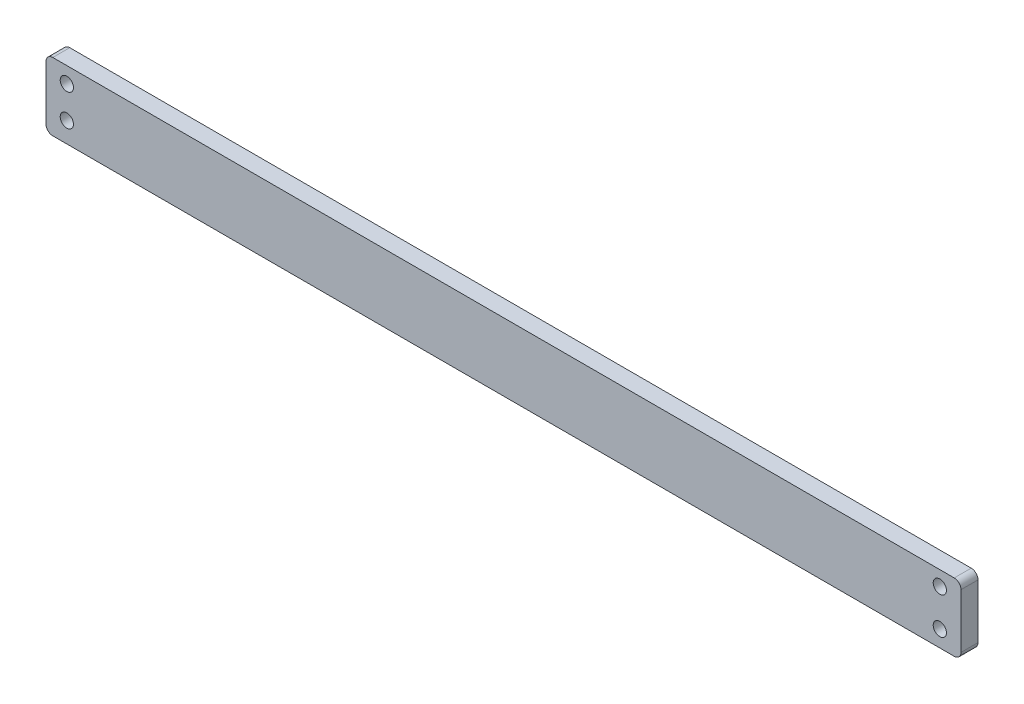
ISO-10303-21;
HEADER;
FILE_DESCRIPTION(('STEP AP214'),'2;1');
FILE_NAME('part.step','',(''),(''),'','','');
FILE_SCHEMA(('AUTOMOTIVE_DESIGN { 1 0 10303 214 1 1 1 1 }'));
ENDSEC;
DATA;
#1=APPLICATION_CONTEXT('core data for automotive mechanical design processes');
#2=APPLICATION_PROTOCOL_DEFINITION('international standard','automotive_design',2000,#1);
#3=PRODUCT_CONTEXT('',#1,'mechanical');
#4=PRODUCT('Part','Part','',(#3));
#5=PRODUCT_RELATED_PRODUCT_CATEGORY('part','',(#4));
#6=PRODUCT_DEFINITION_FORMATION('','',#4);
#7=PRODUCT_DEFINITION_CONTEXT('part definition',#1,'design');
#8=PRODUCT_DEFINITION('design','',#6,#7);
#9=PRODUCT_DEFINITION_SHAPE('','',#8);
#10=(LENGTH_UNIT() NAMED_UNIT(*) SI_UNIT(.MILLI.,.METRE.));
#11=(NAMED_UNIT(*) PLANE_ANGLE_UNIT() SI_UNIT($,.RADIAN.));
#12=(NAMED_UNIT(*) SI_UNIT($,.STERADIAN.) SOLID_ANGLE_UNIT());
#13=UNCERTAINTY_MEASURE_WITH_UNIT(LENGTH_MEASURE(1.E-05),#10,'distance_accuracy_value','');
#14=(GEOMETRIC_REPRESENTATION_CONTEXT(3) GLOBAL_UNCERTAINTY_ASSIGNED_CONTEXT((#13)) GLOBAL_UNIT_ASSIGNED_CONTEXT((#10,
#11,#12)) REPRESENTATION_CONTEXT('',''));
#15=CARTESIAN_POINT('',(0.,0.,0.));
#16=DIRECTION('',(0.,0.,1.));
#17=DIRECTION('',(1.,0.,0.));
#18=AXIS2_PLACEMENT_3D('',#15,#16,#17);
#19=CARTESIAN_POINT('',(-3.51437213559947,54.8154965170172,5.));
#20=DIRECTION('',(0.,0.,-1.));
#21=DIRECTION('',(-1.,0.,0.));
#22=AXIS2_PLACEMENT_3D('',#19,#20,#21);
#23=PLANE('',#22);
#24=CARTESIAN_POINT('',(-3.51437213559947,54.8154965170172,5.));
#25=DIRECTION('',(0.,0.,1.));
#26=DIRECTION('',(-1.,0.,0.));
#27=AXIS2_PLACEMENT_3D('',#24,#25,#26);
#28=CIRCLE('',#27,2.);
#29=CARTESIAN_POINT('',(-3.51437213559947,56.8154965170172,5.));
#30=VERTEX_POINT('',#29);
#31=CARTESIAN_POINT('',(-5.51437213559947,54.8154965170172,5.));
#32=VERTEX_POINT('',#31);
#33=EDGE_CURVE('E149',#30,#32,#28,.T.);
#34=ORIENTED_EDGE('',*,*,#33,.T.);
#35=DIRECTION('',(0.,-1.,0.));
#36=VECTOR('',#35,1.);
#37=CARTESIAN_POINT('',(-5.51437213559947,38.8154965170172,5.));
#38=LINE('',#37,#36);
#39=CARTESIAN_POINT('',(-5.51437213559947,38.8154965170172,5.));
#40=VERTEX_POINT('',#39);
#41=EDGE_CURVE('E97',#32,#40,#38,.T.);
#42=ORIENTED_EDGE('',*,*,#41,.T.);
#43=CARTESIAN_POINT('',(-3.51437213559947,38.8154965170172,5.));
#44=DIRECTION('',(0.,0.,1.));
#45=DIRECTION('',(-1.,0.,0.));
#46=AXIS2_PLACEMENT_3D('',#43,#44,#45);
#47=CIRCLE('',#46,2.);
#48=CARTESIAN_POINT('',(-3.51437213559947,36.8154965170172,5.));
#49=VERTEX_POINT('',#48);
#50=EDGE_CURVE('E164',#40,#49,#47,.T.);
#51=ORIENTED_EDGE('',*,*,#50,.T.);
#52=DIRECTION('',(1.,0.,0.));
#53=VECTOR('',#52,1.);
#54=CARTESIAN_POINT('',(-3.51437213559947,36.8154965170172,5.));
#55=LINE('',#54,#53);
#56=CARTESIAN_POINT('',(262.040865352234,36.8154965170172,5.));
#57=VERTEX_POINT('',#56);
#58=EDGE_CURVE('E177',#49,#57,#55,.T.);
#59=ORIENTED_EDGE('',*,*,#58,.T.);
#60=CARTESIAN_POINT('',(262.040865352234,38.8154965170172,5.));
#61=DIRECTION('',(0.,0.,1.));
#62=DIRECTION('',(1.,0.,0.));
#63=AXIS2_PLACEMENT_3D('',#60,#61,#62);
#64=CIRCLE('',#63,2.);
#65=CARTESIAN_POINT('',(264.040865352234,38.8154965170172,5.));
#66=VERTEX_POINT('',#65);
#67=EDGE_CURVE('E116',#57,#66,#64,.T.);
#68=ORIENTED_EDGE('',*,*,#67,.T.);
#69=DIRECTION('',(0.,1.,0.));
#70=VECTOR('',#69,1.);
#71=CARTESIAN_POINT('',(264.040865352234,38.8154965170172,5.));
#72=LINE('',#71,#70);
#73=CARTESIAN_POINT('',(264.040865352234,54.8154965170172,5.));
#74=VERTEX_POINT('',#73);
#75=EDGE_CURVE('E110',#66,#74,#72,.T.);
#76=ORIENTED_EDGE('',*,*,#75,.T.);
#77=CARTESIAN_POINT('',(262.040865352234,54.8154965170172,5.));
#78=DIRECTION('',(0.,0.,1.));
#79=DIRECTION('',(-1.,0.,0.));
#80=AXIS2_PLACEMENT_3D('',#77,#78,#79);
#81=CIRCLE('',#80,2.);
#82=CARTESIAN_POINT('',(262.040865352234,56.8154965170172,5.));
#83=VERTEX_POINT('',#82);
#84=EDGE_CURVE('E114',#74,#83,#81,.T.);
#85=ORIENTED_EDGE('',*,*,#84,.T.);
#86=DIRECTION('',(-1.,0.,0.));
#87=VECTOR('',#86,1.);
#88=CARTESIAN_POINT('',(-3.51437213559947,56.8154965170172,5.));
#89=LINE('',#88,#87);
#90=EDGE_CURVE('E54',#83,#30,#89,.T.);
#91=ORIENTED_EDGE('',*,*,#90,.T.);
#92=EDGE_LOOP('',(#34,#42,#51,#59,#68,#76,#85,#91));
#93=FACE_BOUND('',#92,.T.);
#94=CARTESIAN_POINT('',(0.621260050170748,42.8077298266429,5.));
#95=DIRECTION('',(0.,0.,1.));
#96=DIRECTION('',(1.,0.,0.));
#97=AXIS2_PLACEMENT_3D('',#94,#95,#96);
#98=CIRCLE('',#97,1.95);
#99=CARTESIAN_POINT('',(2.57126005017075,42.8077298266429,5.));
#100=VERTEX_POINT('',#99);
#101=EDGE_CURVE('E138',#100,#100,#98,.T.);
#102=ORIENTED_EDGE('',*,*,#101,.F.);
#103=EDGE_LOOP('',(#102));
#104=FACE_BOUND('',#103,.T.);
#105=CARTESIAN_POINT('',(0.621260050170748,52.15637262832,5.));
#106=DIRECTION('',(0.,0.,1.));
#107=DIRECTION('',(1.,0.,0.));
#108=AXIS2_PLACEMENT_3D('',#105,#106,#107);
#109=CIRCLE('',#108,1.95);
#110=CARTESIAN_POINT('',(2.57126005017075,52.15637262832,5.));
#111=VERTEX_POINT('',#110);
#112=EDGE_CURVE('E186',#111,#111,#109,.T.);
#113=ORIENTED_EDGE('',*,*,#112,.F.);
#114=EDGE_LOOP('',(#113));
#115=FACE_BOUND('',#114,.T.);
#116=CARTESIAN_POINT('',(257.791885291441,41.6686999628682,5.));
#117=DIRECTION('',(0.,0.,1.));
#118=DIRECTION('',(1.,0.,0.));
#119=AXIS2_PLACEMENT_3D('',#116,#117,#118);
#120=CIRCLE('',#119,1.95000000000003);
#121=CARTESIAN_POINT('',(259.741885291441,41.6686999628682,5.));
#122=VERTEX_POINT('',#121);
#123=EDGE_CURVE('E192',#122,#122,#120,.T.);
#124=ORIENTED_EDGE('',*,*,#123,.F.);
#125=EDGE_LOOP('',(#124));
#126=FACE_BOUND('',#125,.T.);
#127=CARTESIAN_POINT('',(257.791885291441,52.4810500846292,5.));
#128=DIRECTION('',(0.,0.,1.));
#129=DIRECTION('',(1.,0.,0.));
#130=AXIS2_PLACEMENT_3D('',#127,#128,#129);
#131=CIRCLE('',#130,1.95000000000003);
#132=CARTESIAN_POINT('',(259.741885291441,52.4810500846292,5.));
#133=VERTEX_POINT('',#132);
#134=EDGE_CURVE('E198',#133,#133,#131,.T.);
#135=ORIENTED_EDGE('',*,*,#134,.F.);
#136=EDGE_LOOP('',(#135));
#137=FACE_BOUND('',#136,.T.);
#138=ADVANCED_FACE('F37',(#93,#104,#115,#126,#137),#23,.F.);
#139=CARTESIAN_POINT('',(-3.51437213559947,54.8154965170172,0.));
#140=DIRECTION('',(0.,0.,-1.));
#141=DIRECTION('',(-1.,0.,0.));
#142=AXIS2_PLACEMENT_3D('',#139,#140,#141);
#143=PLANE('',#142);
#144=CARTESIAN_POINT('',(257.791885291441,41.6686999628682,0.));
#145=DIRECTION('',(0.,0.,1.));
#146=DIRECTION('',(1.,0.,0.));
#147=AXIS2_PLACEMENT_3D('',#144,#145,#146);
#148=CIRCLE('',#147,1.95000000000003);
#149=CARTESIAN_POINT('',(259.741885291441,41.6686999628682,0.));
#150=VERTEX_POINT('',#149);
#151=EDGE_CURVE('E195',#150,#150,#148,.T.);
#152=ORIENTED_EDGE('',*,*,#151,.T.);
#153=EDGE_LOOP('',(#152));
#154=FACE_BOUND('',#153,.T.);
#155=CARTESIAN_POINT('',(0.621260050170748,42.8077298266429,0.));
#156=DIRECTION('',(0.,0.,1.));
#157=DIRECTION('',(1.,0.,0.));
#158=AXIS2_PLACEMENT_3D('',#155,#156,#157);
#159=CIRCLE('',#158,1.95);
#160=CARTESIAN_POINT('',(2.57126005017075,42.8077298266429,0.));
#161=VERTEX_POINT('',#160);
#162=EDGE_CURVE('E183',#161,#161,#159,.T.);
#163=ORIENTED_EDGE('',*,*,#162,.T.);
#164=EDGE_LOOP('',(#163));
#165=FACE_BOUND('',#164,.T.);
#166=CARTESIAN_POINT('',(-3.51437213559947,54.8154965170172,0.));
#167=DIRECTION('',(0.,0.,1.));
#168=DIRECTION('',(-1.,0.,0.));
#169=AXIS2_PLACEMENT_3D('',#166,#167,#168);
#170=CIRCLE('',#169,2.);
#171=CARTESIAN_POINT('',(-3.51437213559947,56.8154965170172,0.));
#172=VERTEX_POINT('',#171);
#173=CARTESIAN_POINT('',(-5.51437213559947,54.8154965170172,0.));
#174=VERTEX_POINT('',#173);
#175=EDGE_CURVE('E134',#172,#174,#170,.T.);
#176=ORIENTED_EDGE('',*,*,#175,.F.);
#177=DIRECTION('',(-1.,0.,0.));
#178=VECTOR('',#177,1.);
#179=CARTESIAN_POINT('',(-3.51437213559947,56.8154965170172,0.));
#180=LINE('',#179,#178);
#181=CARTESIAN_POINT('',(262.040865352234,56.8154965170172,0.));
#182=VERTEX_POINT('',#181);
#183=EDGE_CURVE('E89',#182,#172,#180,.T.);
#184=ORIENTED_EDGE('',*,*,#183,.F.);
#185=CARTESIAN_POINT('',(262.040865352234,54.8154965170172,0.));
#186=DIRECTION('',(0.,0.,1.));
#187=DIRECTION('',(-1.,0.,0.));
#188=AXIS2_PLACEMENT_3D('',#185,#186,#187);
#189=CIRCLE('',#188,2.);
#190=CARTESIAN_POINT('',(264.040865352234,54.8154965170172,0.));
#191=VERTEX_POINT('',#190);
#192=EDGE_CURVE('E83',#191,#182,#189,.T.);
#193=ORIENTED_EDGE('',*,*,#192,.F.);
#194=DIRECTION('',(0.,1.,0.));
#195=VECTOR('',#194,1.);
#196=CARTESIAN_POINT('',(264.040865352234,38.8154965170172,0.));
#197=LINE('',#196,#195);
#198=CARTESIAN_POINT('',(264.040865352234,38.8154965170172,0.));
#199=VERTEX_POINT('',#198);
#200=EDGE_CURVE('E124',#199,#191,#197,.T.);
#201=ORIENTED_EDGE('',*,*,#200,.F.);
#202=CARTESIAN_POINT('',(262.040865352234,38.8154965170172,0.));
#203=DIRECTION('',(0.,0.,1.));
#204=DIRECTION('',(1.,0.,0.));
#205=AXIS2_PLACEMENT_3D('',#202,#203,#204);
#206=CIRCLE('',#205,2.);
#207=CARTESIAN_POINT('',(262.040865352234,36.8154965170172,0.));
#208=VERTEX_POINT('',#207);
#209=EDGE_CURVE('E144',#208,#199,#206,.T.);
#210=ORIENTED_EDGE('',*,*,#209,.F.);
#211=DIRECTION('',(1.,0.,0.));
#212=VECTOR('',#211,1.);
#213=CARTESIAN_POINT('',(-3.51437213559947,36.8154965170172,0.));
#214=LINE('',#213,#212);
#215=CARTESIAN_POINT('',(-3.51437213559947,36.8154965170172,0.));
#216=VERTEX_POINT('',#215);
#217=EDGE_CURVE('E142',#216,#208,#214,.T.);
#218=ORIENTED_EDGE('',*,*,#217,.F.);
#219=CARTESIAN_POINT('',(-3.51437213559947,38.8154965170172,0.));
#220=DIRECTION('',(0.,0.,1.));
#221=DIRECTION('',(-1.,0.,0.));
#222=AXIS2_PLACEMENT_3D('',#219,#220,#221);
#223=CIRCLE('',#222,2.);
#224=CARTESIAN_POINT('',(-5.51437213559947,38.8154965170172,0.));
#225=VERTEX_POINT('',#224);
#226=EDGE_CURVE('E140',#225,#216,#223,.T.);
#227=ORIENTED_EDGE('',*,*,#226,.F.);
#228=DIRECTION('',(0.,-1.,0.));
#229=VECTOR('',#228,1.);
#230=CARTESIAN_POINT('',(-5.51437213559947,38.8154965170172,0.));
#231=LINE('',#230,#229);
#232=EDGE_CURVE('E137',#174,#225,#231,.T.);
#233=ORIENTED_EDGE('',*,*,#232,.F.);
#234=EDGE_LOOP('',(#176,#184,#193,#201,#210,#218,#227,#233));
#235=FACE_BOUND('',#234,.T.);
#236=CARTESIAN_POINT('',(0.621260050170748,52.15637262832,0.));
#237=DIRECTION('',(0.,0.,1.));
#238=DIRECTION('',(1.,0.,0.));
#239=AXIS2_PLACEMENT_3D('',#236,#237,#238);
#240=CIRCLE('',#239,1.95);
#241=CARTESIAN_POINT('',(2.57126005017075,52.15637262832,0.));
#242=VERTEX_POINT('',#241);
#243=EDGE_CURVE('E189',#242,#242,#240,.T.);
#244=ORIENTED_EDGE('',*,*,#243,.T.);
#245=EDGE_LOOP('',(#244));
#246=FACE_BOUND('',#245,.T.);
#247=CARTESIAN_POINT('',(257.791885291441,52.4810500846292,0.));
#248=DIRECTION('',(0.,0.,1.));
#249=DIRECTION('',(1.,0.,0.));
#250=AXIS2_PLACEMENT_3D('',#247,#248,#249);
#251=CIRCLE('',#250,1.95000000000003);
#252=CARTESIAN_POINT('',(259.741885291441,52.4810500846292,0.));
#253=VERTEX_POINT('',#252);
#254=EDGE_CURVE('E201',#253,#253,#251,.T.);
#255=ORIENTED_EDGE('',*,*,#254,.T.);
#256=EDGE_LOOP('',(#255));
#257=FACE_BOUND('',#256,.T.);
#258=ADVANCED_FACE('F168',(#154,#165,#235,#246,#257),#143,.T.);
#259=CARTESIAN_POINT('',(-3.51437213559947,54.8154965170172,5.));
#260=DIRECTION('',(0.,0.,-1.));
#261=DIRECTION('',(-1.,0.,0.));
#262=AXIS2_PLACEMENT_3D('',#259,#260,#261);
#263=CYLINDRICAL_SURFACE('',#262,2.);
#264=ORIENTED_EDGE('',*,*,#175,.T.);
#265=DIRECTION('',(0.,0.,-1.));
#266=VECTOR('',#265,1.);
#267=CARTESIAN_POINT('',(-5.51437213559947,54.8154965170172,5.));
#268=LINE('',#267,#266);
#269=EDGE_CURVE('E11',#32,#174,#268,.T.);
#270=ORIENTED_EDGE('',*,*,#269,.F.);
#271=ORIENTED_EDGE('',*,*,#33,.F.);
#272=DIRECTION('',(0.,0.,-1.));
#273=VECTOR('',#272,1.);
#274=CARTESIAN_POINT('',(-3.51437213559947,56.8154965170172,5.));
#275=LINE('',#274,#273);
#276=EDGE_CURVE('E130',#30,#172,#275,.T.);
#277=ORIENTED_EDGE('',*,*,#276,.T.);
#278=EDGE_LOOP('',(#264,#270,#271,#277));
#279=FACE_BOUND('',#278,.T.);
#280=ADVANCED_FACE('F39',(#279),#263,.T.);
#281=CARTESIAN_POINT('',(-5.51437213559947,38.8154965170172,5.));
#282=DIRECTION('',(1.,0.,0.));
#283=DIRECTION('',(0.,0.,-1.));
#284=AXIS2_PLACEMENT_3D('',#281,#282,#283);
#285=PLANE('',#284);
#286=ORIENTED_EDGE('',*,*,#232,.T.);
#287=DIRECTION('',(0.,0.,-1.));
#288=VECTOR('',#287,1.);
#289=CARTESIAN_POINT('',(-5.51437213559947,38.8154965170172,5.));
#290=LINE('',#289,#288);
#291=EDGE_CURVE('E46',#40,#225,#290,.T.);
#292=ORIENTED_EDGE('',*,*,#291,.F.);
#293=ORIENTED_EDGE('',*,*,#41,.F.);
#294=ORIENTED_EDGE('',*,*,#269,.T.);
#295=EDGE_LOOP('',(#286,#292,#293,#294));
#296=FACE_BOUND('',#295,.T.);
#297=ADVANCED_FACE('F233',(#296),#285,.F.);
#298=CARTESIAN_POINT('',(-3.51437213559947,38.8154965170172,5.));
#299=DIRECTION('',(0.,0.,-1.));
#300=DIRECTION('',(-1.,0.,0.));
#301=AXIS2_PLACEMENT_3D('',#298,#299,#300);
#302=CYLINDRICAL_SURFACE('',#301,2.);
#303=ORIENTED_EDGE('',*,*,#226,.T.);
#304=DIRECTION('',(0.,0.,-1.));
#305=VECTOR('',#304,1.);
#306=CARTESIAN_POINT('',(-3.51437213559947,36.8154965170172,5.));
#307=LINE('',#306,#305);
#308=EDGE_CURVE('E156',#49,#216,#307,.T.);
#309=ORIENTED_EDGE('',*,*,#308,.F.);
#310=ORIENTED_EDGE('',*,*,#50,.F.);
#311=ORIENTED_EDGE('',*,*,#291,.T.);
#312=EDGE_LOOP('',(#303,#309,#310,#311));
#313=FACE_BOUND('',#312,.T.);
#314=ADVANCED_FACE('F162',(#313),#302,.T.);
#315=CARTESIAN_POINT('',(-3.51437213559947,36.8154965170172,5.));
#316=DIRECTION('',(0.,1.,0.));
#317=DIRECTION('',(0.,0.,1.));
#318=AXIS2_PLACEMENT_3D('',#315,#316,#317);
#319=PLANE('',#318);
#320=ORIENTED_EDGE('',*,*,#217,.T.);
#321=DIRECTION('',(0.,0.,-1.));
#322=VECTOR('',#321,1.);
#323=CARTESIAN_POINT('',(262.040865352234,36.8154965170172,5.));
#324=LINE('',#323,#322);
#325=EDGE_CURVE('E153',#57,#208,#324,.T.);
#326=ORIENTED_EDGE('',*,*,#325,.F.);
#327=ORIENTED_EDGE('',*,*,#58,.F.);
#328=ORIENTED_EDGE('',*,*,#308,.T.);
#329=EDGE_LOOP('',(#320,#326,#327,#328));
#330=FACE_BOUND('',#329,.T.);
#331=ADVANCED_FACE('F173',(#330),#319,.F.);
#332=CARTESIAN_POINT('',(262.040865352234,38.8154965170172,5.));
#333=DIRECTION('',(0.,0.,-1.));
#334=DIRECTION('',(-1.,0.,0.));
#335=AXIS2_PLACEMENT_3D('',#332,#333,#334);
#336=CYLINDRICAL_SURFACE('',#335,2.);
#337=ORIENTED_EDGE('',*,*,#209,.T.);
#338=DIRECTION('',(0.,0.,-1.));
#339=VECTOR('',#338,1.);
#340=CARTESIAN_POINT('',(264.040865352234,38.8154965170172,5.));
#341=LINE('',#340,#339);
#342=EDGE_CURVE('E125',#66,#199,#341,.T.);
#343=ORIENTED_EDGE('',*,*,#342,.F.);
#344=ORIENTED_EDGE('',*,*,#67,.F.);
#345=ORIENTED_EDGE('',*,*,#325,.T.);
#346=EDGE_LOOP('',(#337,#343,#344,#345));
#347=FACE_BOUND('',#346,.T.);
#348=ADVANCED_FACE('F176',(#347),#336,.T.);
#349=CARTESIAN_POINT('',(264.040865352234,38.8154965170172,5.));
#350=DIRECTION('',(-1.,0.,0.));
#351=DIRECTION('',(0.,0.,1.));
#352=AXIS2_PLACEMENT_3D('',#349,#350,#351);
#353=PLANE('',#352);
#354=ORIENTED_EDGE('',*,*,#200,.T.);
#355=DIRECTION('',(0.,0.,-1.));
#356=VECTOR('',#355,1.);
#357=CARTESIAN_POINT('',(264.040865352234,54.8154965170172,5.));
#358=LINE('',#357,#356);
#359=EDGE_CURVE('E121',#74,#191,#358,.T.);
#360=ORIENTED_EDGE('',*,*,#359,.F.);
#361=ORIENTED_EDGE('',*,*,#75,.F.);
#362=ORIENTED_EDGE('',*,*,#342,.T.);
#363=EDGE_LOOP('',(#354,#360,#361,#362));
#364=FACE_BOUND('',#363,.T.);
#365=ADVANCED_FACE('F122',(#364),#353,.F.);
#366=CARTESIAN_POINT('',(262.040865352234,54.8154965170172,5.));
#367=DIRECTION('',(0.,0.,-1.));
#368=DIRECTION('',(-1.,0.,0.));
#369=AXIS2_PLACEMENT_3D('',#366,#367,#368);
#370=CYLINDRICAL_SURFACE('',#369,2.);
#371=ORIENTED_EDGE('',*,*,#192,.T.);
#372=DIRECTION('',(0.,0.,-1.));
#373=VECTOR('',#372,1.);
#374=CARTESIAN_POINT('',(262.040865352234,56.8154965170172,5.));
#375=LINE('',#374,#373);
#376=EDGE_CURVE('E126',#83,#182,#375,.T.);
#377=ORIENTED_EDGE('',*,*,#376,.F.);
#378=ORIENTED_EDGE('',*,*,#84,.F.);
#379=ORIENTED_EDGE('',*,*,#359,.T.);
#380=EDGE_LOOP('',(#371,#377,#378,#379));
#381=FACE_BOUND('',#380,.T.);
#382=ADVANCED_FACE('F128',(#381),#370,.T.);
#383=CARTESIAN_POINT('',(-3.51437213559947,56.8154965170172,5.));
#384=DIRECTION('',(0.,-1.,0.));
#385=DIRECTION('',(0.,0.,-1.));
#386=AXIS2_PLACEMENT_3D('',#383,#384,#385);
#387=PLANE('',#386);
#388=ORIENTED_EDGE('',*,*,#183,.T.);
#389=ORIENTED_EDGE('',*,*,#276,.F.);
#390=ORIENTED_EDGE('',*,*,#90,.F.);
#391=ORIENTED_EDGE('',*,*,#376,.T.);
#392=EDGE_LOOP('',(#388,#389,#390,#391));
#393=FACE_BOUND('',#392,.T.);
#394=ADVANCED_FACE('F221',(#393),#387,.F.);
#395=CARTESIAN_POINT('',(0.621260050170748,42.8077298266429,5.));
#396=DIRECTION('',(0.,0.,-1.));
#397=DIRECTION('',(-1.,0.,0.));
#398=AXIS2_PLACEMENT_3D('',#395,#396,#397);
#399=CYLINDRICAL_SURFACE('',#398,1.95);
#400=ORIENTED_EDGE('',*,*,#101,.T.);
#401=EDGE_LOOP('',(#400));
#402=FACE_BOUND('',#401,.T.);
#403=ORIENTED_EDGE('',*,*,#162,.F.);
#404=EDGE_LOOP('',(#403));
#405=FACE_BOUND('',#404,.T.);
#406=ADVANCED_FACE('F218',(#402,#405),#399,.F.);
#407=CARTESIAN_POINT('',(0.621260050170748,52.15637262832,5.));
#408=DIRECTION('',(0.,0.,-1.));
#409=DIRECTION('',(-1.,0.,0.));
#410=AXIS2_PLACEMENT_3D('',#407,#408,#409);
#411=CYLINDRICAL_SURFACE('',#410,1.95);
#412=ORIENTED_EDGE('',*,*,#112,.T.);
#413=EDGE_LOOP('',(#412));
#414=FACE_BOUND('',#413,.T.);
#415=ORIENTED_EDGE('',*,*,#243,.F.);
#416=EDGE_LOOP('',(#415));
#417=FACE_BOUND('',#416,.T.);
#418=ADVANCED_FACE('F309',(#414,#417),#411,.F.);
#419=CARTESIAN_POINT('',(257.791885291441,41.6686999628682,5.));
#420=DIRECTION('',(0.,0.,-1.));
#421=DIRECTION('',(-1.,0.,0.));
#422=AXIS2_PLACEMENT_3D('',#419,#420,#421);
#423=CYLINDRICAL_SURFACE('',#422,1.95000000000003);
#424=ORIENTED_EDGE('',*,*,#123,.T.);
#425=EDGE_LOOP('',(#424));
#426=FACE_BOUND('',#425,.T.);
#427=ORIENTED_EDGE('',*,*,#151,.F.);
#428=EDGE_LOOP('',(#427));
#429=FACE_BOUND('',#428,.T.);
#430=ADVANCED_FACE('F318',(#426,#429),#423,.F.);
#431=CARTESIAN_POINT('',(257.791885291441,52.4810500846292,5.));
#432=DIRECTION('',(0.,0.,-1.));
#433=DIRECTION('',(-1.,0.,0.));
#434=AXIS2_PLACEMENT_3D('',#431,#432,#433);
#435=CYLINDRICAL_SURFACE('',#434,1.95000000000003);
#436=ORIENTED_EDGE('',*,*,#134,.T.);
#437=EDGE_LOOP('',(#436));
#438=FACE_BOUND('',#437,.T.);
#439=ORIENTED_EDGE('',*,*,#254,.F.);
#440=EDGE_LOOP('',(#439));
#441=FACE_BOUND('',#440,.T.);
#442=ADVANCED_FACE('F207',(#438,#441),#435,.F.);
#443=CLOSED_SHELL('',(#138,#258,#280,#297,#314,#331,#348,#365,#382,#394,#406,#418,#430,#442));
#444=MANIFOLD_SOLID_BREP('B2',#443);
#445=ADVANCED_BREP_SHAPE_REPRESENTATION('',(#18,#444),#14);
#446=SHAPE_DEFINITION_REPRESENTATION(#9,#445);
ENDSEC;
END-ISO-10303-21;
